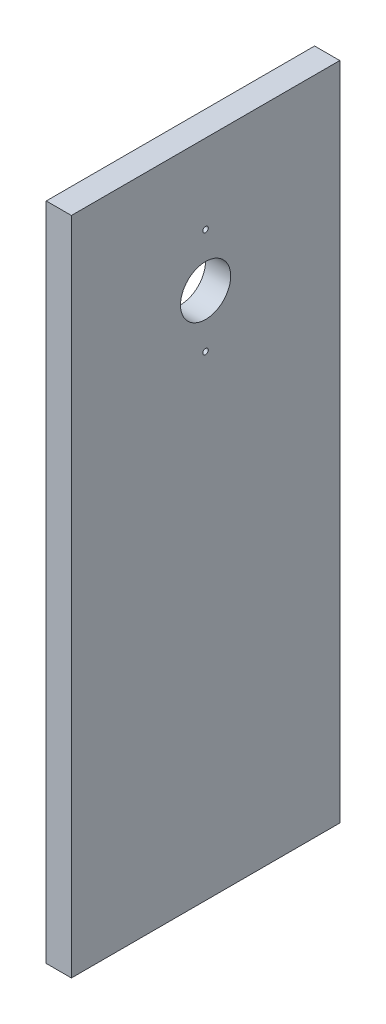
ISO-10303-21;
HEADER;
FILE_DESCRIPTION(('STEP AP214'),'2;1');
FILE_NAME('part.step','',(''),(''),'','','');
FILE_SCHEMA(('AUTOMOTIVE_DESIGN { 1 0 10303 214 1 1 1 1 }'));
ENDSEC;
DATA;
#1=APPLICATION_CONTEXT('core data for automotive mechanical design processes');
#2=APPLICATION_PROTOCOL_DEFINITION('international standard','automotive_design',2000,#1);
#3=PRODUCT_CONTEXT('',#1,'mechanical');
#4=PRODUCT('Part','Part','',(#3));
#5=PRODUCT_RELATED_PRODUCT_CATEGORY('part','',(#4));
#6=PRODUCT_DEFINITION_FORMATION('','',#4);
#7=PRODUCT_DEFINITION_CONTEXT('part definition',#1,'design');
#8=PRODUCT_DEFINITION('design','',#6,#7);
#9=PRODUCT_DEFINITION_SHAPE('','',#8);
#10=(LENGTH_UNIT() NAMED_UNIT(*) SI_UNIT(.MILLI.,.METRE.));
#11=(NAMED_UNIT(*) PLANE_ANGLE_UNIT() SI_UNIT($,.RADIAN.));
#12=(NAMED_UNIT(*) SI_UNIT($,.STERADIAN.) SOLID_ANGLE_UNIT());
#13=UNCERTAINTY_MEASURE_WITH_UNIT(LENGTH_MEASURE(1.E-05),#10,'distance_accuracy_value','');
#14=(GEOMETRIC_REPRESENTATION_CONTEXT(3) GLOBAL_UNCERTAINTY_ASSIGNED_CONTEXT((#13)) GLOBAL_UNIT_ASSIGNED_CONTEXT((#10,
#11,#12)) REPRESENTATION_CONTEXT('',''));
#15=CARTESIAN_POINT('',(0.,0.,0.));
#16=DIRECTION('',(0.,0.,1.));
#17=DIRECTION('',(1.,0.,0.));
#18=AXIS2_PLACEMENT_3D('',#15,#16,#17);
#19=CARTESIAN_POINT('',(-65.0273576817566,134.525,13.1975325749012));
#20=DIRECTION('',(1.,0.,0.));
#21=DIRECTION('',(0.,1.,0.));
#22=AXIS2_PLACEMENT_3D('',#19,#20,#21);
#23=PLANE('',#22);
#24=CARTESIAN_POINT('',(-65.0273576817566,209.525,13.1975325749012));
#25=DIRECTION('',(1.,0.,0.));
#26=DIRECTION('',(0.,-1.,0.));
#27=AXIS2_PLACEMENT_3D('',#24,#25,#26);
#28=CIRCLE('',#27,9.5);
#29=CARTESIAN_POINT('',(-65.0273576817566,219.025,13.1975325749012));
#30=VERTEX_POINT('',#29);
#31=EDGE_CURVE('E110',#30,#30,#28,.T.);
#32=ORIENTED_EDGE('',*,*,#31,.T.);
#33=EDGE_LOOP('',(#32));
#34=FACE_BOUND('',#33,.T.);
#35=CARTESIAN_POINT('',(-65.0273576817566,229.525,13.1975325749012));
#36=DIRECTION('',(1.,0.,0.));
#37=DIRECTION('',(0.,-1.,0.));
#38=AXIS2_PLACEMENT_3D('',#35,#36,#37);
#39=CIRCLE('',#38,1.03775);
#40=CARTESIAN_POINT('',(-65.0273576817566,230.56275,13.1975325749012));
#41=VERTEX_POINT('',#40);
#42=EDGE_CURVE('E89',#41,#41,#39,.T.);
#43=ORIENTED_EDGE('',*,*,#42,.T.);
#44=EDGE_LOOP('',(#43));
#45=FACE_BOUND('',#44,.T.);
#46=CARTESIAN_POINT('',(-65.0273576817566,189.525,13.1975325749012));
#47=DIRECTION('',(1.,0.,0.));
#48=DIRECTION('',(0.,-1.,0.));
#49=AXIS2_PLACEMENT_3D('',#46,#47,#48);
#50=CIRCLE('',#49,1.03775);
#51=CARTESIAN_POINT('',(-65.0273576817566,190.56275,13.1975325749012));
#52=VERTEX_POINT('',#51);
#53=EDGE_CURVE('E100',#52,#52,#50,.T.);
#54=ORIENTED_EDGE('',*,*,#53,.T.);
#55=EDGE_LOOP('',(#54));
#56=FACE_BOUND('',#55,.T.);
#57=DIRECTION('',(0.,1.,0.));
#58=VECTOR('',#57,1.);
#59=CARTESIAN_POINT('',(-65.0273576817566,9.525,-37.6024674250988));
#60=LINE('',#59,#58);
#61=CARTESIAN_POINT('',(-65.0273576817566,9.525,-37.6024674250988));
#62=VERTEX_POINT('',#61);
#63=CARTESIAN_POINT('',(-65.0273576817566,259.525,-37.6024674250988));
#64=VERTEX_POINT('',#63);
#65=EDGE_CURVE('E26',#62,#64,#60,.T.);
#66=ORIENTED_EDGE('',*,*,#65,.F.);
#67=DIRECTION('',(0.,0.,-1.));
#68=VECTOR('',#67,1.);
#69=CARTESIAN_POINT('',(-65.0273576817566,9.525,63.9975325749012));
#70=LINE('',#69,#68);
#71=CARTESIAN_POINT('',(-65.0273576817566,9.525,63.9975325749012));
#72=VERTEX_POINT('',#71);
#73=EDGE_CURVE('E129',#72,#62,#70,.T.);
#74=ORIENTED_EDGE('',*,*,#73,.F.);
#75=DIRECTION('',(0.,-1.,0.));
#76=VECTOR('',#75,1.);
#77=CARTESIAN_POINT('',(-65.0273576817566,259.525,63.9975325749012));
#78=LINE('',#77,#76);
#79=CARTESIAN_POINT('',(-65.0273576817566,259.525,63.9975325749012));
#80=VERTEX_POINT('',#79);
#81=EDGE_CURVE('E106',#80,#72,#78,.T.);
#82=ORIENTED_EDGE('',*,*,#81,.F.);
#83=DIRECTION('',(0.,0.,1.));
#84=VECTOR('',#83,1.);
#85=CARTESIAN_POINT('',(-65.0273576817566,259.525,-37.6024674250988));
#86=LINE('',#85,#84);
#87=EDGE_CURVE('E124',#64,#80,#86,.T.);
#88=ORIENTED_EDGE('',*,*,#87,.F.);
#89=EDGE_LOOP('',(#66,#74,#82,#88));
#90=FACE_BOUND('',#89,.T.);
#91=ADVANCED_FACE('F16',(#34,#45,#56,#90),#23,.F.);
#92=CARTESIAN_POINT('',(-55.5023576817566,134.525,13.1975325749012));
#93=DIRECTION('',(1.,0.,0.));
#94=DIRECTION('',(0.,1.,0.));
#95=AXIS2_PLACEMENT_3D('',#92,#93,#94);
#96=PLANE('',#95);
#97=CARTESIAN_POINT('',(-55.5023576817566,209.525,13.1975325749012));
#98=DIRECTION('',(-1.,0.,0.));
#99=DIRECTION('',(0.,-1.,0.));
#100=AXIS2_PLACEMENT_3D('',#97,#98,#99);
#101=CIRCLE('',#100,9.5);
#102=CARTESIAN_POINT('',(-55.5023576817566,219.025,13.1975325749012));
#103=VERTEX_POINT('',#102);
#104=EDGE_CURVE('E125',#103,#103,#101,.T.);
#105=ORIENTED_EDGE('',*,*,#104,.T.);
#106=EDGE_LOOP('',(#105));
#107=FACE_BOUND('',#106,.T.);
#108=CARTESIAN_POINT('',(-55.5023576817566,229.525,13.1975325749012));
#109=DIRECTION('',(-1.,0.,0.));
#110=DIRECTION('',(0.,-1.,0.));
#111=AXIS2_PLACEMENT_3D('',#108,#109,#110);
#112=CIRCLE('',#111,1.03775);
#113=CARTESIAN_POINT('',(-55.5023576817566,230.56275,13.1975325749012));
#114=VERTEX_POINT('',#113);
#115=EDGE_CURVE('E115',#114,#114,#112,.T.);
#116=ORIENTED_EDGE('',*,*,#115,.T.);
#117=EDGE_LOOP('',(#116));
#118=FACE_BOUND('',#117,.T.);
#119=CARTESIAN_POINT('',(-55.5023576817566,189.525,13.1975325749012));
#120=DIRECTION('',(-1.,0.,0.));
#121=DIRECTION('',(0.,-1.,0.));
#122=AXIS2_PLACEMENT_3D('',#119,#120,#121);
#123=CIRCLE('',#122,1.03775);
#124=CARTESIAN_POINT('',(-55.5023576817566,190.56275,13.1975325749012));
#125=VERTEX_POINT('',#124);
#126=EDGE_CURVE('E84',#125,#125,#123,.T.);
#127=ORIENTED_EDGE('',*,*,#126,.T.);
#128=EDGE_LOOP('',(#127));
#129=FACE_BOUND('',#128,.T.);
#130=DIRECTION('',(0.,1.,0.));
#131=VECTOR('',#130,1.);
#132=CARTESIAN_POINT('',(-55.5023576817566,9.525,-37.6024674250988));
#133=LINE('',#132,#131);
#134=CARTESIAN_POINT('',(-55.5023576817566,9.525,-37.6024674250988));
#135=VERTEX_POINT('',#134);
#136=CARTESIAN_POINT('',(-55.5023576817566,259.525,-37.6024674250988));
#137=VERTEX_POINT('',#136);
#138=EDGE_CURVE('E11',#135,#137,#133,.T.);
#139=ORIENTED_EDGE('',*,*,#138,.T.);
#140=DIRECTION('',(0.,0.,1.));
#141=VECTOR('',#140,1.);
#142=CARTESIAN_POINT('',(-55.5023576817566,259.525,-37.6024674250988));
#143=LINE('',#142,#141);
#144=CARTESIAN_POINT('',(-55.5023576817566,259.525,63.9975325749012));
#145=VERTEX_POINT('',#144);
#146=EDGE_CURVE('E119',#137,#145,#143,.T.);
#147=ORIENTED_EDGE('',*,*,#146,.T.);
#148=DIRECTION('',(0.,-1.,0.));
#149=VECTOR('',#148,1.);
#150=CARTESIAN_POINT('',(-55.5023576817566,259.525,63.9975325749012));
#151=LINE('',#150,#149);
#152=CARTESIAN_POINT('',(-55.5023576817566,9.525,63.9975325749012));
#153=VERTEX_POINT('',#152);
#154=EDGE_CURVE('E107',#145,#153,#151,.T.);
#155=ORIENTED_EDGE('',*,*,#154,.T.);
#156=DIRECTION('',(0.,0.,-1.));
#157=VECTOR('',#156,1.);
#158=CARTESIAN_POINT('',(-55.5023576817566,9.525,63.9975325749012));
#159=LINE('',#158,#157);
#160=EDGE_CURVE('E104',#153,#135,#159,.T.);
#161=ORIENTED_EDGE('',*,*,#160,.T.);
#162=EDGE_LOOP('',(#139,#147,#155,#161));
#163=FACE_BOUND('',#162,.T.);
#164=ADVANCED_FACE('F85',(#107,#118,#129,#163),#96,.T.);
#165=CARTESIAN_POINT('',(-65.0273576817566,9.525,-37.6024674250988));
#166=DIRECTION('',(0.,0.,-1.));
#167=DIRECTION('',(0.,-1.,0.));
#168=AXIS2_PLACEMENT_3D('',#165,#166,#167);
#169=PLANE('',#168);
#170=ORIENTED_EDGE('',*,*,#65,.T.);
#171=DIRECTION('',(1.,0.,0.));
#172=VECTOR('',#171,1.);
#173=CARTESIAN_POINT('',(-65.0273576817566,259.525,-37.6024674250988));
#174=LINE('',#173,#172);
#175=EDGE_CURVE('E116',#64,#137,#174,.T.);
#176=ORIENTED_EDGE('',*,*,#175,.T.);
#177=ORIENTED_EDGE('',*,*,#138,.F.);
#178=DIRECTION('',(1.,0.,0.));
#179=VECTOR('',#178,1.);
#180=CARTESIAN_POINT('',(-65.0273576817566,9.525,-37.6024674250988));
#181=LINE('',#180,#179);
#182=EDGE_CURVE('E138',#62,#135,#181,.T.);
#183=ORIENTED_EDGE('',*,*,#182,.F.);
#184=EDGE_LOOP('',(#170,#176,#177,#183));
#185=FACE_BOUND('',#184,.T.);
#186=ADVANCED_FACE('F163',(#185),#169,.T.);
#187=CARTESIAN_POINT('',(-65.0273576817566,259.525,-37.6024674250988));
#188=DIRECTION('',(0.,1.,0.));
#189=DIRECTION('',(1.,0.,0.));
#190=AXIS2_PLACEMENT_3D('',#187,#188,#189);
#191=PLANE('',#190);
#192=ORIENTED_EDGE('',*,*,#87,.T.);
#193=DIRECTION('',(1.,0.,0.));
#194=VECTOR('',#193,1.);
#195=CARTESIAN_POINT('',(-65.0273576817566,259.525,63.9975325749012));
#196=LINE('',#195,#194);
#197=EDGE_CURVE('E120',#80,#145,#196,.T.);
#198=ORIENTED_EDGE('',*,*,#197,.T.);
#199=ORIENTED_EDGE('',*,*,#146,.F.);
#200=ORIENTED_EDGE('',*,*,#175,.F.);
#201=EDGE_LOOP('',(#192,#198,#199,#200));
#202=FACE_BOUND('',#201,.T.);
#203=ADVANCED_FACE('F205',(#202),#191,.T.);
#204=CARTESIAN_POINT('',(-65.0273576817566,259.525,63.9975325749012));
#205=DIRECTION('',(0.,0.,1.));
#206=DIRECTION('',(1.,0.,0.));
#207=AXIS2_PLACEMENT_3D('',#204,#205,#206);
#208=PLANE('',#207);
#209=ORIENTED_EDGE('',*,*,#81,.T.);
#210=DIRECTION('',(1.,0.,0.));
#211=VECTOR('',#210,1.);
#212=CARTESIAN_POINT('',(-65.0273576817566,9.525,63.9975325749012));
#213=LINE('',#212,#211);
#214=EDGE_CURVE('E108',#72,#153,#213,.T.);
#215=ORIENTED_EDGE('',*,*,#214,.T.);
#216=ORIENTED_EDGE('',*,*,#154,.F.);
#217=ORIENTED_EDGE('',*,*,#197,.F.);
#218=EDGE_LOOP('',(#209,#215,#216,#217));
#219=FACE_BOUND('',#218,.T.);
#220=ADVANCED_FACE('F18',(#219),#208,.T.);
#221=CARTESIAN_POINT('',(-65.0273576817566,9.525,63.9975325749012));
#222=DIRECTION('',(0.,-1.,0.));
#223=DIRECTION('',(0.,0.,-1.));
#224=AXIS2_PLACEMENT_3D('',#221,#222,#223);
#225=PLANE('',#224);
#226=ORIENTED_EDGE('',*,*,#73,.T.);
#227=ORIENTED_EDGE('',*,*,#182,.T.);
#228=ORIENTED_EDGE('',*,*,#160,.F.);
#229=ORIENTED_EDGE('',*,*,#214,.F.);
#230=EDGE_LOOP('',(#226,#227,#228,#229));
#231=FACE_BOUND('',#230,.T.);
#232=ADVANCED_FACE('F152',(#231),#225,.T.);
#233=CARTESIAN_POINT('',(-59.7886076817566,209.525,13.1975325749012));
#234=DIRECTION('',(1.,0.,0.));
#235=DIRECTION('',(0.,-1.,0.));
#236=AXIS2_PLACEMENT_3D('',#233,#234,#235);
#237=CYLINDRICAL_SURFACE('',#236,9.5);
#238=ORIENTED_EDGE('',*,*,#31,.F.);
#239=DIRECTION('',(1.,0.,0.));
#240=VECTOR('',#239,1.);
#241=CARTESIAN_POINT('',(-59.7886076817566,219.025,13.1975325749012));
#242=LINE('',#241,#240);
#243=EDGE_CURVE('E114',#30,#103,#242,.T.);
#244=ORIENTED_EDGE('',*,*,#243,.T.);
#245=ORIENTED_EDGE('',*,*,#104,.F.);
#246=ORIENTED_EDGE('',*,*,#243,.F.);
#247=EDGE_LOOP('',(#238,#244,#245,#246));
#248=FACE_BOUND('',#247,.T.);
#249=ADVANCED_FACE('F179',(#248),#237,.F.);
#250=CARTESIAN_POINT('',(-35.0273576817566,229.525,13.1975325749012));
#251=DIRECTION('',(1.,0.,0.));
#252=DIRECTION('',(0.,-1.,0.));
#253=AXIS2_PLACEMENT_3D('',#250,#251,#252);
#254=CYLINDRICAL_SURFACE('',#253,1.03775);
#255=ORIENTED_EDGE('',*,*,#42,.F.);
#256=DIRECTION('',(1.,0.,0.));
#257=VECTOR('',#256,1.);
#258=CARTESIAN_POINT('',(-35.0273576817566,230.56275,13.1975325749012));
#259=LINE('',#258,#257);
#260=EDGE_CURVE('E97',#41,#114,#259,.T.);
#261=ORIENTED_EDGE('',*,*,#260,.T.);
#262=ORIENTED_EDGE('',*,*,#115,.F.);
#263=ORIENTED_EDGE('',*,*,#260,.F.);
#264=EDGE_LOOP('',(#255,#261,#262,#263));
#265=FACE_BOUND('',#264,.T.);
#266=ADVANCED_FACE('F189',(#265),#254,.F.);
#267=CARTESIAN_POINT('',(-35.0273576817566,189.525,13.1975325749012));
#268=DIRECTION('',(1.,0.,0.));
#269=DIRECTION('',(0.,-1.,0.));
#270=AXIS2_PLACEMENT_3D('',#267,#268,#269);
#271=CYLINDRICAL_SURFACE('',#270,1.03775);
#272=ORIENTED_EDGE('',*,*,#53,.F.);
#273=DIRECTION('',(1.,0.,0.));
#274=VECTOR('',#273,1.);
#275=CARTESIAN_POINT('',(-35.0273576817566,190.56275,13.1975325749012));
#276=LINE('',#275,#274);
#277=EDGE_CURVE('E90',#52,#125,#276,.T.);
#278=ORIENTED_EDGE('',*,*,#277,.T.);
#279=ORIENTED_EDGE('',*,*,#126,.F.);
#280=ORIENTED_EDGE('',*,*,#277,.F.);
#281=EDGE_LOOP('',(#272,#278,#279,#280));
#282=FACE_BOUND('',#281,.T.);
#283=ADVANCED_FACE('F187',(#282),#271,.F.);
#284=CLOSED_SHELL('',(#91,#164,#186,#203,#220,#232,#249,#266,#283));
#285=MANIFOLD_SOLID_BREP('B1',#284);
#286=ADVANCED_BREP_SHAPE_REPRESENTATION('',(#18,#285),#14);
#287=SHAPE_DEFINITION_REPRESENTATION(#9,#286);
ENDSEC;
END-ISO-10303-21;
